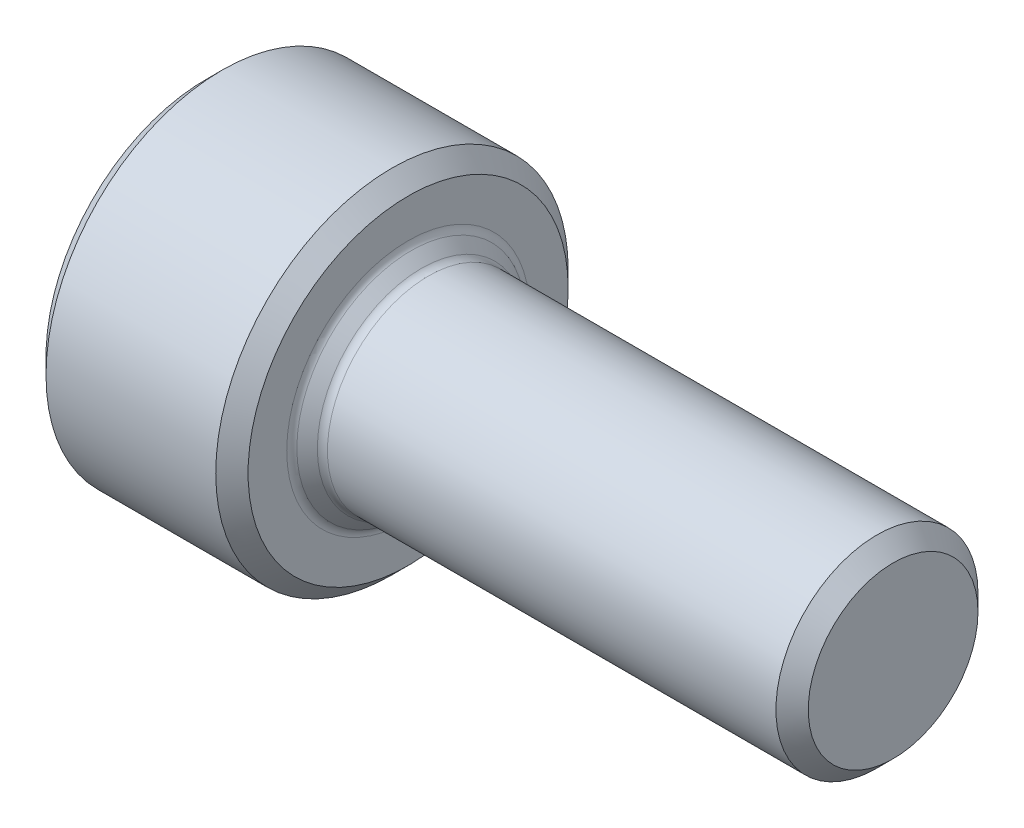
ISO-10303-21;
HEADER;
FILE_DESCRIPTION(('STEP AP214'),'2;1');
FILE_NAME('part.step','',(''),(''),'','','');
FILE_SCHEMA(('AUTOMOTIVE_DESIGN { 1 0 10303 214 1 1 1 1 }'));
ENDSEC;
DATA;
#1=APPLICATION_CONTEXT('core data for automotive mechanical design processes');
#2=APPLICATION_PROTOCOL_DEFINITION('international standard','automotive_design',2000,#1);
#3=PRODUCT_CONTEXT('',#1,'mechanical');
#4=PRODUCT('Part','Part','',(#3));
#5=PRODUCT_RELATED_PRODUCT_CATEGORY('part','',(#4));
#6=PRODUCT_DEFINITION_FORMATION('','',#4);
#7=PRODUCT_DEFINITION_CONTEXT('part definition',#1,'design');
#8=PRODUCT_DEFINITION('design','',#6,#7);
#9=PRODUCT_DEFINITION_SHAPE('','',#8);
#10=(LENGTH_UNIT() NAMED_UNIT(*) SI_UNIT(.MILLI.,.METRE.));
#11=(NAMED_UNIT(*) PLANE_ANGLE_UNIT() SI_UNIT($,.RADIAN.));
#12=(NAMED_UNIT(*) SI_UNIT($,.STERADIAN.) SOLID_ANGLE_UNIT());
#13=UNCERTAINTY_MEASURE_WITH_UNIT(LENGTH_MEASURE(1.E-05),#10,'distance_accuracy_value','');
#14=(GEOMETRIC_REPRESENTATION_CONTEXT(3) GLOBAL_UNCERTAINTY_ASSIGNED_CONTEXT((#13)) GLOBAL_UNIT_ASSIGNED_CONTEXT((#10,
#11,#12)) REPRESENTATION_CONTEXT('',''));
#15=CARTESIAN_POINT('',(0.,0.,0.));
#16=DIRECTION('',(0.,0.,1.));
#17=DIRECTION('',(1.,0.,0.));
#18=AXIS2_PLACEMENT_3D('',#15,#16,#17);
#19=CARTESIAN_POINT('',(0.,0.,0.));
#20=DIRECTION('',(1.,0.,0.));
#21=DIRECTION('',(0.,0.,-1.));
#22=AXIS2_PLACEMENT_3D('',#19,#20,#21);
#23=PLANE('',#22);
#24=CARTESIAN_POINT('',(0.,0.,0.));
#25=DIRECTION('',(1.,0.,0.));
#26=DIRECTION('',(0.,0.,-1.));
#27=AXIS2_PLACEMENT_3D('',#24,#25,#26);
#28=CIRCLE('',#27,3.00355339059327);
#29=CARTESIAN_POINT('',(0.,0.,-3.00355339059327));
#30=VERTEX_POINT('',#29);
#31=EDGE_CURVE('E11',#30,#30,#28,.F.);
#32=ORIENTED_EDGE('',*,*,#31,.T.);
#33=EDGE_LOOP('',(#32));
#34=FACE_BOUND('',#33,.T.);
#35=CARTESIAN_POINT('',(0.,0.,0.));
#36=DIRECTION('',(1.,0.,0.));
#37=DIRECTION('',(0.,0.,-1.));
#38=AXIS2_PLACEMENT_3D('',#35,#36,#37);
#39=CIRCLE('',#38,3.96);
#40=CARTESIAN_POINT('',(0.,0.,-3.96));
#41=VERTEX_POINT('',#40);
#42=EDGE_CURVE('E274',#41,#41,#39,.T.);
#43=ORIENTED_EDGE('',*,*,#42,.T.);
#44=EDGE_LOOP('',(#43));
#45=FACE_BOUND('',#44,.T.);
#46=ADVANCED_FACE('F34',(#34,#45),#23,.T.);
#47=CARTESIAN_POINT('',(-5.,0.,0.));
#48=DIRECTION('',(-1.,0.,0.));
#49=DIRECTION('',(0.,0.,1.));
#50=AXIS2_PLACEMENT_3D('',#47,#48,#49);
#51=CYLINDRICAL_SURFACE('',#50,2.);
#52=CARTESIAN_POINT('',(-5.,0.,0.));
#53=DIRECTION('',(-1.,0.,0.));
#54=DIRECTION('',(0.,0.,1.));
#55=AXIS2_PLACEMENT_3D('',#52,#53,#54);
#56=CIRCLE('',#55,2.);
#57=CARTESIAN_POINT('',(-5.,-1.21563870436552,1.58815066679724));
#58=VERTEX_POINT('',#57);
#59=CARTESIAN_POINT('',(-5.,-0.76755947030084,1.84684933320276));
#60=VERTEX_POINT('',#59);
#61=EDGE_CURVE('E265',#58,#60,#56,.T.);
#62=ORIENTED_EDGE('',*,*,#61,.T.);
#63=DIRECTION('',(-1.,0.,0.));
#64=VECTOR('',#63,1.);
#65=CARTESIAN_POINT('',(-5.,-0.76755947030084,1.84684933320276));
#66=LINE('',#65,#64);
#67=CARTESIAN_POINT('',(-2.5,-0.76755947030084,1.84684933320276));
#68=VERTEX_POINT('',#67);
#69=EDGE_CURVE('E260',#60,#68,#66,.F.);
#70=ORIENTED_EDGE('',*,*,#69,.T.);
#71=CARTESIAN_POINT('',(-2.5,0.,0.));
#72=DIRECTION('',(-1.,0.,0.));
#73=DIRECTION('',(0.,0.,1.));
#74=AXIS2_PLACEMENT_3D('',#71,#72,#73);
#75=CIRCLE('',#74,2.);
#76=CARTESIAN_POINT('',(-2.5,-1.21563870436552,1.58815066679724));
#77=VERTEX_POINT('',#76);
#78=EDGE_CURVE('E688',#77,#68,#75,.T.);
#79=ORIENTED_EDGE('',*,*,#78,.F.);
#80=DIRECTION('',(-1.,0.,0.));
#81=VECTOR('',#80,1.);
#82=CARTESIAN_POINT('',(-5.,-1.21563870436552,1.58815066679724));
#83=LINE('',#82,#81);
#84=EDGE_CURVE('E257',#77,#58,#83,.T.);
#85=ORIENTED_EDGE('',*,*,#84,.T.);
#86=EDGE_LOOP('',(#62,#70,#79,#85));
#87=FACE_BOUND('',#86,.T.);
#88=ADVANCED_FACE('F329',(#87),#51,.F.);
#89=CARTESIAN_POINT('',(-5.,-1.98319817466636,-0.258698666405527));
#90=VERTEX_POINT('',#89);
#91=CARTESIAN_POINT('',(-5.,-1.98319817466636,0.258698666405525));
#92=VERTEX_POINT('',#91);
#93=EDGE_CURVE('E647',#90,#92,#56,.T.);
#94=ORIENTED_EDGE('',*,*,#93,.T.);
#95=DIRECTION('',(-1.,0.,0.));
#96=VECTOR('',#95,1.);
#97=CARTESIAN_POINT('',(-5.,-1.98319817466636,0.258698666405525));
#98=LINE('',#97,#96);
#99=CARTESIAN_POINT('',(-2.5,-1.98319817466636,0.258698666405525));
#100=VERTEX_POINT('',#99);
#101=EDGE_CURVE('E254',#92,#100,#98,.F.);
#102=ORIENTED_EDGE('',*,*,#101,.T.);
#103=CARTESIAN_POINT('',(-2.5,-1.98319817466636,-0.258698666405527));
#104=VERTEX_POINT('',#103);
#105=EDGE_CURVE('E683',#104,#100,#75,.T.);
#106=ORIENTED_EDGE('',*,*,#105,.F.);
#107=DIRECTION('',(-1.,0.,0.));
#108=VECTOR('',#107,1.);
#109=CARTESIAN_POINT('',(-5.,-1.98319817466636,-0.258698666405527));
#110=LINE('',#109,#108);
#111=EDGE_CURVE('E251',#104,#90,#110,.T.);
#112=ORIENTED_EDGE('',*,*,#111,.T.);
#113=EDGE_LOOP('',(#94,#102,#106,#112));
#114=FACE_BOUND('',#113,.T.);
#115=ADVANCED_FACE('F335',(#114),#51,.F.);
#116=CARTESIAN_POINT('',(-5.,-0.76755947030084,-1.84684933320276));
#117=VERTEX_POINT('',#116);
#118=CARTESIAN_POINT('',(-5.,-1.21563870436552,-1.58815066679724));
#119=VERTEX_POINT('',#118);
#120=EDGE_CURVE('E649',#117,#119,#56,.T.);
#121=ORIENTED_EDGE('',*,*,#120,.T.);
#122=DIRECTION('',(-1.,0.,0.));
#123=VECTOR('',#122,1.);
#124=CARTESIAN_POINT('',(-5.,-1.21563870436552,-1.58815066679724));
#125=LINE('',#124,#123);
#126=CARTESIAN_POINT('',(-2.5,-1.21563870436552,-1.58815066679724));
#127=VERTEX_POINT('',#126);
#128=EDGE_CURVE('E248',#119,#127,#125,.F.);
#129=ORIENTED_EDGE('',*,*,#128,.T.);
#130=CARTESIAN_POINT('',(-2.5,-0.76755947030084,-1.84684933320276));
#131=VERTEX_POINT('',#130);
#132=EDGE_CURVE('E678',#131,#127,#75,.T.);
#133=ORIENTED_EDGE('',*,*,#132,.F.);
#134=DIRECTION('',(-1.,0.,0.));
#135=VECTOR('',#134,1.);
#136=CARTESIAN_POINT('',(-5.,-0.767559470300843,-1.84684933320276));
#137=LINE('',#136,#135);
#138=EDGE_CURVE('E245',#131,#117,#137,.T.);
#139=ORIENTED_EDGE('',*,*,#138,.T.);
#140=EDGE_LOOP('',(#121,#129,#133,#139));
#141=FACE_BOUND('',#140,.T.);
#142=ADVANCED_FACE('F564',(#141),#51,.F.);
#143=CARTESIAN_POINT('',(-5.,1.21563870436552,-1.58815066679724));
#144=VERTEX_POINT('',#143);
#145=CARTESIAN_POINT('',(-5.,0.767559470300844,-1.84684933320276));
#146=VERTEX_POINT('',#145);
#147=EDGE_CURVE('E652',#144,#146,#56,.T.);
#148=ORIENTED_EDGE('',*,*,#147,.T.);
#149=DIRECTION('',(-1.,0.,0.));
#150=VECTOR('',#149,1.);
#151=CARTESIAN_POINT('',(-5.,0.767559470300847,-1.84684933320276));
#152=LINE('',#151,#150);
#153=CARTESIAN_POINT('',(-2.5,0.767559470300844,-1.84684933320276));
#154=VERTEX_POINT('',#153);
#155=EDGE_CURVE('E242',#146,#154,#152,.F.);
#156=ORIENTED_EDGE('',*,*,#155,.T.);
#157=CARTESIAN_POINT('',(-2.5,1.21563870436552,-1.58815066679724));
#158=VERTEX_POINT('',#157);
#159=EDGE_CURVE('E675',#158,#154,#75,.T.);
#160=ORIENTED_EDGE('',*,*,#159,.F.);
#161=DIRECTION('',(-1.,0.,0.));
#162=VECTOR('',#161,1.);
#163=CARTESIAN_POINT('',(-5.,1.21563870436552,-1.58815066679724));
#164=LINE('',#163,#162);
#165=EDGE_CURVE('E239',#158,#144,#164,.T.);
#166=ORIENTED_EDGE('',*,*,#165,.T.);
#167=EDGE_LOOP('',(#148,#156,#160,#166));
#168=FACE_BOUND('',#167,.T.);
#169=ADVANCED_FACE('F572',(#168),#51,.F.);
#170=CARTESIAN_POINT('',(-5.,1.98319817466637,0.258698666405524));
#171=VERTEX_POINT('',#170);
#172=CARTESIAN_POINT('',(-5.,1.98319817466637,-0.258698666405522));
#173=VERTEX_POINT('',#172);
#174=EDGE_CURVE('E271',#171,#173,#56,.T.);
#175=ORIENTED_EDGE('',*,*,#174,.T.);
#176=DIRECTION('',(-1.,0.,0.));
#177=VECTOR('',#176,1.);
#178=CARTESIAN_POINT('',(-5.,1.98319817466637,-0.258698666405522));
#179=LINE('',#178,#177);
#180=CARTESIAN_POINT('',(-2.5,1.98319817466637,-0.258698666405522));
#181=VERTEX_POINT('',#180);
#182=EDGE_CURVE('E236',#173,#181,#179,.F.);
#183=ORIENTED_EDGE('',*,*,#182,.T.);
#184=CARTESIAN_POINT('',(-2.5,1.98319817466637,0.258698666405524));
#185=VERTEX_POINT('',#184);
#186=EDGE_CURVE('E674',#185,#181,#75,.T.);
#187=ORIENTED_EDGE('',*,*,#186,.F.);
#188=DIRECTION('',(-1.,0.,0.));
#189=VECTOR('',#188,1.);
#190=CARTESIAN_POINT('',(-5.,1.98319817466637,0.258698666405524));
#191=LINE('',#190,#189);
#192=EDGE_CURVE('E233',#185,#171,#191,.T.);
#193=ORIENTED_EDGE('',*,*,#192,.T.);
#194=EDGE_LOOP('',(#175,#183,#187,#193));
#195=FACE_BOUND('',#194,.T.);
#196=ADVANCED_FACE('F345',(#195),#51,.F.);
#197=CARTESIAN_POINT('',(-5.,0.,0.));
#198=DIRECTION('',(1.,0.,0.));
#199=DIRECTION('',(0.,0.,-1.));
#200=AXIS2_PLACEMENT_3D('',#197,#198,#199);
#201=CYLINDRICAL_SURFACE('',#200,4.36);
#202=CARTESIAN_POINT('',(-4.6,0.,0.));
#203=DIRECTION('',(1.,0.,0.));
#204=DIRECTION('',(0.,0.,-1.));
#205=AXIS2_PLACEMENT_3D('',#202,#203,#204);
#206=CIRCLE('',#205,4.36);
#207=CARTESIAN_POINT('',(-4.6,0.,-4.36));
#208=VERTEX_POINT('',#207);
#209=EDGE_CURVE('E280',#208,#208,#206,.T.);
#210=ORIENTED_EDGE('',*,*,#209,.T.);
#211=EDGE_LOOP('',(#210));
#212=FACE_BOUND('',#211,.T.);
#213=CARTESIAN_POINT('',(-0.4,0.,0.));
#214=DIRECTION('',(1.,0.,0.));
#215=DIRECTION('',(0.,0.,-1.));
#216=AXIS2_PLACEMENT_3D('',#213,#214,#215);
#217=CIRCLE('',#216,4.36);
#218=CARTESIAN_POINT('',(-0.4,0.,-4.36));
#219=VERTEX_POINT('',#218);
#220=EDGE_CURVE('E277',#219,#219,#217,.F.);
#221=ORIENTED_EDGE('',*,*,#220,.T.);
#222=EDGE_LOOP('',(#221));
#223=FACE_BOUND('',#222,.T.);
#224=ADVANCED_FACE('F343',(#212,#223),#201,.T.);
#225=CARTESIAN_POINT('',(-5.,0.,0.));
#226=DIRECTION('',(1.,0.,0.));
#227=DIRECTION('',(0.,0.,-1.));
#228=AXIS2_PLACEMENT_3D('',#225,#226,#227);
#229=PLANE('',#228);
#230=CARTESIAN_POINT('',(-5.,0.,0.));
#231=DIRECTION('',(1.,0.,0.));
#232=DIRECTION('',(0.,0.,-1.));
#233=AXIS2_PLACEMENT_3D('',#230,#231,#232);
#234=CIRCLE('',#233,3.95999999999999);
#235=CARTESIAN_POINT('',(-5.,0.,-3.95999999999999));
#236=VERTEX_POINT('',#235);
#237=EDGE_CURVE('E283',#236,#236,#234,.F.);
#238=ORIENTED_EDGE('',*,*,#237,.T.);
#239=EDGE_LOOP('',(#238));
#240=FACE_BOUND('',#239,.T.);
#241=ORIENTED_EDGE('',*,*,#61,.F.);
#242=DIRECTION('',(0.,0.866025403784439,0.5));
#243=VECTOR('',#242,1.);
#244=CARTESIAN_POINT('',(-5.,-1.98319817466637,1.145));
#245=LINE('',#244,#243);
#246=CARTESIAN_POINT('',(-5.,-1.98319817466637,1.145));
#247=VERTEX_POINT('',#246);
#248=EDGE_CURVE('E199',#247,#58,#245,.T.);
#249=ORIENTED_EDGE('',*,*,#248,.F.);
#250=DIRECTION('',(0.,0.,1.));
#251=VECTOR('',#250,1.);
#252=CARTESIAN_POINT('',(-5.,-1.98319817466636,-1.145));
#253=LINE('',#252,#251);
#254=EDGE_CURVE('E213',#92,#247,#253,.T.);
#255=ORIENTED_EDGE('',*,*,#254,.F.);
#256=ORIENTED_EDGE('',*,*,#93,.F.);
#257=CARTESIAN_POINT('',(-5.,-1.98319817466636,-1.145));
#258=VERTEX_POINT('',#257);
#259=EDGE_CURVE('E171',#258,#90,#253,.T.);
#260=ORIENTED_EDGE('',*,*,#259,.F.);
#261=DIRECTION('',(0.,-0.866025403784439,0.5));
#262=VECTOR('',#261,1.);
#263=CARTESIAN_POINT('',(-5.,0.,-2.29));
#264=LINE('',#263,#262);
#265=EDGE_CURVE('E210',#119,#258,#264,.T.);
#266=ORIENTED_EDGE('',*,*,#265,.F.);
#267=ORIENTED_EDGE('',*,*,#120,.F.);
#268=CARTESIAN_POINT('',(-5.,0.,-2.29));
#269=VERTEX_POINT('',#268);
#270=EDGE_CURVE('E211',#269,#117,#264,.T.);
#271=ORIENTED_EDGE('',*,*,#270,.F.);
#272=DIRECTION('',(0.,-0.866025403784439,-0.5));
#273=VECTOR('',#272,1.);
#274=CARTESIAN_POINT('',(-5.,1.98319817466637,-1.145));
#275=LINE('',#274,#273);
#276=EDGE_CURVE('E207',#146,#269,#275,.T.);
#277=ORIENTED_EDGE('',*,*,#276,.F.);
#278=ORIENTED_EDGE('',*,*,#147,.F.);
#279=CARTESIAN_POINT('',(-5.,1.98319817466637,-1.145));
#280=VERTEX_POINT('',#279);
#281=EDGE_CURVE('E208',#280,#144,#275,.T.);
#282=ORIENTED_EDGE('',*,*,#281,.F.);
#283=DIRECTION('',(0.,0.,-1.));
#284=VECTOR('',#283,1.);
#285=CARTESIAN_POINT('',(-5.,1.98319817466636,1.145));
#286=LINE('',#285,#284);
#287=EDGE_CURVE('E204',#173,#280,#286,.T.);
#288=ORIENTED_EDGE('',*,*,#287,.F.);
#289=ORIENTED_EDGE('',*,*,#174,.F.);
#290=CARTESIAN_POINT('',(-5.,1.98319817466636,1.145));
#291=VERTEX_POINT('',#290);
#292=EDGE_CURVE('E205',#291,#171,#286,.T.);
#293=ORIENTED_EDGE('',*,*,#292,.F.);
#294=DIRECTION('',(0.,0.866025403784439,-0.5));
#295=VECTOR('',#294,1.);
#296=CARTESIAN_POINT('',(-5.,0.,2.29));
#297=LINE('',#296,#295);
#298=CARTESIAN_POINT('',(-5.,1.21563870436553,1.58815066679724));
#299=VERTEX_POINT('',#298);
#300=EDGE_CURVE('E201',#299,#291,#297,.T.);
#301=ORIENTED_EDGE('',*,*,#300,.F.);
#302=CARTESIAN_POINT('',(-5.,0.767559470300838,1.84684933320276));
#303=VERTEX_POINT('',#302);
#304=EDGE_CURVE('E267',#303,#299,#56,.T.);
#305=ORIENTED_EDGE('',*,*,#304,.F.);
#306=CARTESIAN_POINT('',(-5.,0.,2.29));
#307=VERTEX_POINT('',#306);
#308=EDGE_CURVE('E202',#307,#303,#297,.T.);
#309=ORIENTED_EDGE('',*,*,#308,.F.);
#310=EDGE_CURVE('E177',#60,#307,#245,.T.);
#311=ORIENTED_EDGE('',*,*,#310,.F.);
#312=EDGE_LOOP('',(#241,#249,#255,#256,#260,#266,#267,#271,#277,#278,#282,#288,#289,#293,#301,
#305,#309,#311));
#313=FACE_BOUND('',#312,.T.);
#314=ADVANCED_FACE('F342',(#240,#313),#229,.F.);
#315=ORIENTED_EDGE('',*,*,#304,.T.);
#316=DIRECTION('',(-1.,0.,0.));
#317=VECTOR('',#316,1.);
#318=CARTESIAN_POINT('',(-5.,1.21563870436553,1.58815066679723));
#319=LINE('',#318,#317);
#320=CARTESIAN_POINT('',(-2.5,1.21563870436553,1.58815066679724));
#321=VERTEX_POINT('',#320);
#322=EDGE_CURVE('E230',#299,#321,#319,.F.);
#323=ORIENTED_EDGE('',*,*,#322,.T.);
#324=CARTESIAN_POINT('',(-2.5,0.767559470300838,1.84684933320277));
#325=VERTEX_POINT('',#324);
#326=EDGE_CURVE('E262',#325,#321,#75,.T.);
#327=ORIENTED_EDGE('',*,*,#326,.F.);
#328=DIRECTION('',(-1.,0.,0.));
#329=VECTOR('',#328,1.);
#330=CARTESIAN_POINT('',(-5.,0.767559470300835,1.84684933320277));
#331=LINE('',#330,#329);
#332=EDGE_CURVE('E184',#325,#303,#331,.T.);
#333=ORIENTED_EDGE('',*,*,#332,.T.);
#334=EDGE_LOOP('',(#315,#323,#327,#333));
#335=FACE_BOUND('',#334,.T.);
#336=ADVANCED_FACE('F338',(#335),#51,.F.);
#337=CARTESIAN_POINT('',(-2.5,0.,0.));
#338=DIRECTION('',(-1.,0.,0.));
#339=DIRECTION('',(0.,0.,1.));
#340=AXIS2_PLACEMENT_3D('',#337,#338,#339);
#341=CONICAL_SURFACE('',#340,2.,1.0471975511966);
#342=CARTESIAN_POINT('',(-1.34529946162075,0.,0.));
#343=VERTEX_POINT('',#342);
#344=VERTEX_LOOP('',#343);
#345=FACE_BOUND('',#344,.T.);
#346=ORIENTED_EDGE('',*,*,#326,.T.);
#347=EDGE_CURVE('E266',#321,#185,#75,.T.);
#348=ORIENTED_EDGE('',*,*,#347,.T.);
#349=ORIENTED_EDGE('',*,*,#186,.T.);
#350=EDGE_CURVE('E671',#181,#158,#75,.T.);
#351=ORIENTED_EDGE('',*,*,#350,.T.);
#352=ORIENTED_EDGE('',*,*,#159,.T.);
#353=EDGE_CURVE('E676',#154,#131,#75,.T.);
#354=ORIENTED_EDGE('',*,*,#353,.T.);
#355=ORIENTED_EDGE('',*,*,#132,.T.);
#356=EDGE_CURVE('E680',#127,#104,#75,.T.);
#357=ORIENTED_EDGE('',*,*,#356,.T.);
#358=ORIENTED_EDGE('',*,*,#105,.T.);
#359=EDGE_CURVE('E685',#100,#77,#75,.T.);
#360=ORIENTED_EDGE('',*,*,#359,.T.);
#361=ORIENTED_EDGE('',*,*,#78,.T.);
#362=EDGE_CURVE('E168',#68,#325,#75,.T.);
#363=ORIENTED_EDGE('',*,*,#362,.T.);
#364=EDGE_LOOP('',(#346,#348,#349,#351,#352,#354,#355,#357,#358,#360,#361,#363));
#365=FACE_BOUND('',#364,.T.);
#366=ADVANCED_FACE('F551',(#345,#365),#341,.F.);
#367=CARTESIAN_POINT('',(-2.5,1.98319817466636,3.435));
#368=DIRECTION('',(-1.,0.,0.));
#369=DIRECTION('',(0.,0.,1.));
#370=AXIS2_PLACEMENT_3D('',#367,#368,#369);
#371=PLANE('',#370);
#372=ORIENTED_EDGE('',*,*,#362,.F.);
#373=DIRECTION('',(0.,0.866025403784439,0.5));
#374=VECTOR('',#373,1.);
#375=CARTESIAN_POINT('',(-2.5,-1.98319817466637,1.145));
#376=LINE('',#375,#374);
#377=CARTESIAN_POINT('',(-2.5,0.,2.29));
#378=VERTEX_POINT('',#377);
#379=EDGE_CURVE('E161',#68,#378,#376,.T.);
#380=ORIENTED_EDGE('',*,*,#379,.T.);
#381=DIRECTION('',(0.,0.866025403784439,-0.5));
#382=VECTOR('',#381,1.);
#383=CARTESIAN_POINT('',(-2.5,0.,2.29));
#384=LINE('',#383,#382);
#385=EDGE_CURVE('E165',#378,#325,#384,.T.);
#386=ORIENTED_EDGE('',*,*,#385,.T.);
#387=EDGE_LOOP('',(#372,#380,#386));
#388=FACE_BOUND('',#387,.T.);
#389=ADVANCED_FACE('F163',(#388),#371,.T.);
#390=CARTESIAN_POINT('',(-2.5,0.,2.29));
#391=DIRECTION('',(0.,0.5,0.866025403784439));
#392=DIRECTION('',(0.,-0.866025403784439,0.5));
#393=AXIS2_PLACEMENT_3D('',#390,#391,#392);
#394=PLANE('',#393);
#395=ORIENTED_EDGE('',*,*,#385,.F.);
#396=DIRECTION('',(-1.,0.,0.));
#397=VECTOR('',#396,1.);
#398=CARTESIAN_POINT('',(-2.5,0.,2.29));
#399=LINE('',#398,#397);
#400=EDGE_CURVE('E174',#378,#307,#399,.T.);
#401=ORIENTED_EDGE('',*,*,#400,.T.);
#402=ORIENTED_EDGE('',*,*,#308,.T.);
#403=ORIENTED_EDGE('',*,*,#332,.F.);
#404=EDGE_LOOP('',(#395,#401,#402,#403));
#405=FACE_BOUND('',#404,.T.);
#406=ADVANCED_FACE('F182',(#405),#394,.F.);
#407=CARTESIAN_POINT('',(-2.5,-1.98319817466637,1.145));
#408=DIRECTION('',(0.,-0.5,0.866025403784439));
#409=DIRECTION('',(0.,-0.866025403784439,-0.5));
#410=AXIS2_PLACEMENT_3D('',#407,#408,#409);
#411=PLANE('',#410);
#412=ORIENTED_EDGE('',*,*,#310,.T.);
#413=ORIENTED_EDGE('',*,*,#400,.F.);
#414=ORIENTED_EDGE('',*,*,#379,.F.);
#415=ORIENTED_EDGE('',*,*,#69,.F.);
#416=EDGE_LOOP('',(#412,#413,#414,#415));
#417=FACE_BOUND('',#416,.T.);
#418=ADVANCED_FACE('F175',(#417),#411,.F.);
#419=ORIENTED_EDGE('',*,*,#347,.F.);
#420=CARTESIAN_POINT('',(-2.5,1.98319817466636,1.145));
#421=VERTEX_POINT('',#420);
#422=EDGE_CURVE('E186',#321,#421,#384,.T.);
#423=ORIENTED_EDGE('',*,*,#422,.T.);
#424=DIRECTION('',(0.,0.,-1.));
#425=VECTOR('',#424,1.);
#426=CARTESIAN_POINT('',(-2.5,1.98319817466636,1.145));
#427=LINE('',#426,#425);
#428=EDGE_CURVE('E188',#421,#185,#427,.T.);
#429=ORIENTED_EDGE('',*,*,#428,.T.);
#430=EDGE_LOOP('',(#419,#423,#429));
#431=FACE_BOUND('',#430,.T.);
#432=ADVANCED_FACE('F509',(#431),#371,.T.);
#433=ORIENTED_EDGE('',*,*,#300,.T.);
#434=DIRECTION('',(-1.,0.,0.));
#435=VECTOR('',#434,1.);
#436=CARTESIAN_POINT('',(-2.5,1.98319817466636,1.145));
#437=LINE('',#436,#435);
#438=EDGE_CURVE('E180',#421,#291,#437,.T.);
#439=ORIENTED_EDGE('',*,*,#438,.F.);
#440=ORIENTED_EDGE('',*,*,#422,.F.);
#441=ORIENTED_EDGE('',*,*,#322,.F.);
#442=EDGE_LOOP('',(#433,#439,#440,#441));
#443=FACE_BOUND('',#442,.T.);
#444=ADVANCED_FACE('F516',(#443),#394,.F.);
#445=CARTESIAN_POINT('',(-2.5,1.98319817466636,1.145));
#446=DIRECTION('',(0.,1.,0.));
#447=DIRECTION('',(0.,0.,1.));
#448=AXIS2_PLACEMENT_3D('',#445,#446,#447);
#449=PLANE('',#448);
#450=ORIENTED_EDGE('',*,*,#428,.F.);
#451=ORIENTED_EDGE('',*,*,#438,.T.);
#452=ORIENTED_EDGE('',*,*,#292,.T.);
#453=ORIENTED_EDGE('',*,*,#192,.F.);
#454=EDGE_LOOP('',(#450,#451,#452,#453));
#455=FACE_BOUND('',#454,.T.);
#456=ADVANCED_FACE('F501',(#455),#449,.F.);
#457=ORIENTED_EDGE('',*,*,#350,.F.);
#458=CARTESIAN_POINT('',(-2.5,1.98319817466637,-1.145));
#459=VERTEX_POINT('',#458);
#460=EDGE_CURVE('E185',#181,#459,#427,.T.);
#461=ORIENTED_EDGE('',*,*,#460,.T.);
#462=DIRECTION('',(0.,-0.866025403784439,-0.5));
#463=VECTOR('',#462,1.);
#464=CARTESIAN_POINT('',(-2.5,1.98319817466637,-1.145));
#465=LINE('',#464,#463);
#466=EDGE_CURVE('E192',#459,#158,#465,.T.);
#467=ORIENTED_EDGE('',*,*,#466,.T.);
#468=EDGE_LOOP('',(#457,#461,#467));
#469=FACE_BOUND('',#468,.T.);
#470=ADVANCED_FACE('F484',(#469),#371,.T.);
#471=ORIENTED_EDGE('',*,*,#287,.T.);
#472=DIRECTION('',(-1.,0.,0.));
#473=VECTOR('',#472,1.);
#474=CARTESIAN_POINT('',(-2.5,1.98319817466637,-1.145));
#475=LINE('',#474,#473);
#476=EDGE_CURVE('E224',#459,#280,#475,.T.);
#477=ORIENTED_EDGE('',*,*,#476,.F.);
#478=ORIENTED_EDGE('',*,*,#460,.F.);
#479=ORIENTED_EDGE('',*,*,#182,.F.);
#480=EDGE_LOOP('',(#471,#477,#478,#479));
#481=FACE_BOUND('',#480,.T.);
#482=ADVANCED_FACE('F491',(#481),#449,.F.);
#483=CARTESIAN_POINT('',(-2.5,1.98319817466637,-1.145));
#484=DIRECTION('',(0.,0.5,-0.866025403784439));
#485=DIRECTION('',(0.,0.866025403784439,0.5));
#486=AXIS2_PLACEMENT_3D('',#483,#484,#485);
#487=PLANE('',#486);
#488=ORIENTED_EDGE('',*,*,#466,.F.);
#489=ORIENTED_EDGE('',*,*,#476,.T.);
#490=ORIENTED_EDGE('',*,*,#281,.T.);
#491=ORIENTED_EDGE('',*,*,#165,.F.);
#492=EDGE_LOOP('',(#488,#489,#490,#491));
#493=FACE_BOUND('',#492,.T.);
#494=ADVANCED_FACE('F476',(#493),#487,.F.);
#495=ORIENTED_EDGE('',*,*,#353,.F.);
#496=CARTESIAN_POINT('',(-2.5,0.,-2.29));
#497=VERTEX_POINT('',#496);
#498=EDGE_CURVE('E191',#154,#497,#465,.T.);
#499=ORIENTED_EDGE('',*,*,#498,.T.);
#500=DIRECTION('',(0.,-0.866025403784439,0.5));
#501=VECTOR('',#500,1.);
#502=CARTESIAN_POINT('',(-2.5,0.,-2.29));
#503=LINE('',#502,#501);
#504=EDGE_CURVE('E195',#497,#131,#503,.T.);
#505=ORIENTED_EDGE('',*,*,#504,.T.);
#506=EDGE_LOOP('',(#495,#499,#505));
#507=FACE_BOUND('',#506,.T.);
#508=ADVANCED_FACE('F459',(#507),#371,.T.);
#509=ORIENTED_EDGE('',*,*,#276,.T.);
#510=DIRECTION('',(-1.,0.,0.));
#511=VECTOR('',#510,1.);
#512=CARTESIAN_POINT('',(-2.5,0.,-2.29));
#513=LINE('',#512,#511);
#514=EDGE_CURVE('E221',#497,#269,#513,.T.);
#515=ORIENTED_EDGE('',*,*,#514,.F.);
#516=ORIENTED_EDGE('',*,*,#498,.F.);
#517=ORIENTED_EDGE('',*,*,#155,.F.);
#518=EDGE_LOOP('',(#509,#515,#516,#517));
#519=FACE_BOUND('',#518,.T.);
#520=ADVANCED_FACE('F466',(#519),#487,.F.);
#521=CARTESIAN_POINT('',(-2.5,0.,-2.29));
#522=DIRECTION('',(0.,-0.5,-0.866025403784439));
#523=DIRECTION('',(0.,0.866025403784439,-0.5));
#524=AXIS2_PLACEMENT_3D('',#521,#522,#523);
#525=PLANE('',#524);
#526=ORIENTED_EDGE('',*,*,#504,.F.);
#527=ORIENTED_EDGE('',*,*,#514,.T.);
#528=ORIENTED_EDGE('',*,*,#270,.T.);
#529=ORIENTED_EDGE('',*,*,#138,.F.);
#530=EDGE_LOOP('',(#526,#527,#528,#529));
#531=FACE_BOUND('',#530,.T.);
#532=ADVANCED_FACE('F452',(#531),#525,.F.);
#533=ORIENTED_EDGE('',*,*,#356,.F.);
#534=CARTESIAN_POINT('',(-2.5,-1.98319817466636,-1.145));
#535=VERTEX_POINT('',#534);
#536=EDGE_CURVE('E194',#127,#535,#503,.T.);
#537=ORIENTED_EDGE('',*,*,#536,.T.);
#538=DIRECTION('',(0.,0.,1.));
#539=VECTOR('',#538,1.);
#540=CARTESIAN_POINT('',(-2.5,-1.98319817466636,-1.145));
#541=LINE('',#540,#539);
#542=EDGE_CURVE('E57',#535,#104,#541,.T.);
#543=ORIENTED_EDGE('',*,*,#542,.T.);
#544=EDGE_LOOP('',(#533,#537,#543));
#545=FACE_BOUND('',#544,.T.);
#546=ADVANCED_FACE('F416',(#545),#371,.T.);
#547=ORIENTED_EDGE('',*,*,#265,.T.);
#548=DIRECTION('',(-1.,0.,0.));
#549=VECTOR('',#548,1.);
#550=CARTESIAN_POINT('',(-2.5,-1.98319817466636,-1.145));
#551=LINE('',#550,#549);
#552=EDGE_CURVE('E218',#535,#258,#551,.T.);
#553=ORIENTED_EDGE('',*,*,#552,.F.);
#554=ORIENTED_EDGE('',*,*,#536,.F.);
#555=ORIENTED_EDGE('',*,*,#128,.F.);
#556=EDGE_LOOP('',(#547,#553,#554,#555));
#557=FACE_BOUND('',#556,.T.);
#558=ADVANCED_FACE('F442',(#557),#525,.F.);
#559=CARTESIAN_POINT('',(-2.5,-1.98319817466636,-1.145));
#560=DIRECTION('',(0.,-1.,0.));
#561=DIRECTION('',(0.,0.,-1.));
#562=AXIS2_PLACEMENT_3D('',#559,#560,#561);
#563=PLANE('',#562);
#564=ORIENTED_EDGE('',*,*,#542,.F.);
#565=ORIENTED_EDGE('',*,*,#552,.T.);
#566=ORIENTED_EDGE('',*,*,#259,.T.);
#567=ORIENTED_EDGE('',*,*,#111,.F.);
#568=EDGE_LOOP('',(#564,#565,#566,#567));
#569=FACE_BOUND('',#568,.T.);
#570=ADVANCED_FACE('F427',(#569),#563,.F.);
#571=CARTESIAN_POINT('',(-2.5,-1.98319817466637,1.145));
#572=VERTEX_POINT('',#571);
#573=EDGE_CURVE('E49',#572,#77,#376,.T.);
#574=ORIENTED_EDGE('',*,*,#573,.F.);
#575=DIRECTION('',(-1.,0.,0.));
#576=VECTOR('',#575,1.);
#577=CARTESIAN_POINT('',(-2.5,-1.98319817466637,1.145));
#578=LINE('',#577,#576);
#579=EDGE_CURVE('E215',#572,#247,#578,.T.);
#580=ORIENTED_EDGE('',*,*,#579,.T.);
#581=ORIENTED_EDGE('',*,*,#248,.T.);
#582=ORIENTED_EDGE('',*,*,#84,.F.);
#583=EDGE_LOOP('',(#574,#580,#581,#582));
#584=FACE_BOUND('',#583,.T.);
#585=ADVANCED_FACE('F424',(#584),#411,.F.);
#586=ORIENTED_EDGE('',*,*,#254,.T.);
#587=ORIENTED_EDGE('',*,*,#579,.F.);
#588=EDGE_CURVE('E197',#100,#572,#541,.T.);
#589=ORIENTED_EDGE('',*,*,#588,.F.);
#590=ORIENTED_EDGE('',*,*,#101,.F.);
#591=EDGE_LOOP('',(#586,#587,#589,#590));
#592=FACE_BOUND('',#591,.T.);
#593=ADVANCED_FACE('F414',(#592),#563,.F.);
#594=ORIENTED_EDGE('',*,*,#359,.F.);
#595=ORIENTED_EDGE('',*,*,#588,.T.);
#596=ORIENTED_EDGE('',*,*,#573,.T.);
#597=EDGE_LOOP('',(#594,#595,#596));
#598=FACE_BOUND('',#597,.T.);
#599=ADVANCED_FACE('F310',(#598),#371,.T.);
#600=CARTESIAN_POINT('',(12.,0.,0.));
#601=DIRECTION('',(-1.,0.,0.));
#602=DIRECTION('',(0.,0.,1.));
#603=AXIS2_PLACEMENT_3D('',#600,#601,#602);
#604=CYLINDRICAL_SURFACE('',#603,2.5);
#605=CARTESIAN_POINT('',(0.503553390593273,0.,0.));
#606=DIRECTION('',(1.,0.,0.));
#607=DIRECTION('',(0.,0.,-1.));
#608=AXIS2_PLACEMENT_3D('',#605,#606,#607);
#609=CIRCLE('',#608,2.5);
#610=CARTESIAN_POINT('',(0.503553390593273,0.,-2.5));
#611=VERTEX_POINT('',#610);
#612=EDGE_CURVE('E289',#611,#611,#609,.T.);
#613=ORIENTED_EDGE('',*,*,#612,.T.);
#614=EDGE_LOOP('',(#613));
#615=FACE_BOUND('',#614,.T.);
#616=CARTESIAN_POINT('',(11.6,0.,0.));
#617=DIRECTION('',(1.,0.,0.));
#618=DIRECTION('',(0.,0.,-1.));
#619=AXIS2_PLACEMENT_3D('',#616,#617,#618);
#620=CIRCLE('',#619,2.5);
#621=CARTESIAN_POINT('',(11.6,0.,-2.5));
#622=VERTEX_POINT('',#621);
#623=EDGE_CURVE('E270',#622,#622,#620,.F.);
#624=ORIENTED_EDGE('',*,*,#623,.T.);
#625=EDGE_LOOP('',(#624));
#626=FACE_BOUND('',#625,.T.);
#627=ADVANCED_FACE('F306',(#615,#626),#604,.T.);
#628=CARTESIAN_POINT('',(12.,0.,0.));
#629=DIRECTION('',(1.,0.,0.));
#630=DIRECTION('',(0.,0.,-1.));
#631=AXIS2_PLACEMENT_3D('',#628,#629,#630);
#632=PLANE('',#631);
#633=CARTESIAN_POINT('',(12.,0.,0.));
#634=DIRECTION('',(1.,0.,0.));
#635=DIRECTION('',(0.,0.,-1.));
#636=AXIS2_PLACEMENT_3D('',#633,#634,#635);
#637=CIRCLE('',#636,2.1);
#638=CARTESIAN_POINT('',(12.,0.,-2.1));
#639=VERTEX_POINT('',#638);
#640=EDGE_CURVE('E286',#639,#639,#637,.T.);
#641=ORIENTED_EDGE('',*,*,#640,.T.);
#642=EDGE_LOOP('',(#641));
#643=FACE_BOUND('',#642,.T.);
#644=ADVANCED_FACE('F309',(#643),#632,.T.);
#645=CARTESIAN_POINT('',(0.399999999999999,0.,0.));
#646=DIRECTION('',(-1.,0.,0.));
#647=DIRECTION('',(0.,0.,1.));
#648=AXIS2_PLACEMENT_3D('',#645,#646,#647);
#649=CONICAL_SURFACE('',#648,2.5,0.785398163397442);
#650=CARTESIAN_POINT('',(0.326776695296637,0.,0.));
#651=DIRECTION('',(-1.,0.,0.));
#652=DIRECTION('',(0.,0.,1.));
#653=AXIS2_PLACEMENT_3D('',#650,#651,#652);
#654=CIRCLE('',#653,2.57322330470336);
#655=CARTESIAN_POINT('',(0.326776695296637,0.,2.57322330470336));
#656=VERTEX_POINT('',#655);
#657=EDGE_CURVE('E42',#656,#656,#654,.T.);
#658=CARTESIAN_POINT('',(0.0732233047033648,0.,0.));
#659=DIRECTION('',(1.,0.,0.));
#660=DIRECTION('',(0.,0.,-1.));
#661=AXIS2_PLACEMENT_3D('',#658,#659,#660);
#662=CIRCLE('',#661,2.82677669529663);
#663=CARTESIAN_POINT('',(0.0732233047033648,0.,2.82677669529663));
#664=VERTEX_POINT('',#663);
#665=EDGE_CURVE('E292',#664,#664,#662,.T.);
#666=CARTESIAN_POINT('',(0.326776695296637,0.,2.57322330470336));
#667=CARTESIAN_POINT('',(0.324135514144624,0.,2.57586448585537));
#668=CARTESIAN_POINT('',(0.321494332992611,0.,2.57850566700739));
#669=CARTESIAN_POINT('',(0.316211970688584,0.,2.58378802931141));
#670=CARTESIAN_POINT('',(0.313570789536571,0.,2.58642921046343));
#671=CARTESIAN_POINT('',(0.308288427232544,0.,2.59171157276745));
#672=CARTESIAN_POINT('',(0.305647246080531,0.,2.59435275391947));
#673=CARTESIAN_POINT('',(0.300364883776505,0.,2.59963511622349));
#674=CARTESIAN_POINT('',(0.297723702624491,0.,2.60227629737551));
#675=CARTESIAN_POINT('',(0.292441340320465,0.,2.60755865967953));
#676=CARTESIAN_POINT('',(0.289800159168452,0.,2.61019984083155));
#677=CARTESIAN_POINT('',(0.284517796864425,0.,2.61548220313557));
#678=CARTESIAN_POINT('',(0.281876615712412,0.,2.61812338428759));
#679=CARTESIAN_POINT('',(0.276594253408385,0.,2.62340574659161));
#680=CARTESIAN_POINT('',(0.273953072256372,0.,2.62604692774363));
#681=CARTESIAN_POINT('',(0.268670709952346,0.,2.63132929004765));
#682=CARTESIAN_POINT('',(0.266029528800332,0.,2.63397047119967));
#683=CARTESIAN_POINT('',(0.260747166496306,0.,2.63925283350369));
#684=CARTESIAN_POINT('',(0.258105985344293,0.,2.64189401465571));
#685=CARTESIAN_POINT('',(0.252823623040266,0.,2.64717637695973));
#686=CARTESIAN_POINT('',(0.250182441888253,0.,2.64981755811174));
#687=CARTESIAN_POINT('',(0.244900079584226,0.,2.65509992041577));
#688=CARTESIAN_POINT('',(0.242258898432213,0.,2.65774110156778));
#689=CARTESIAN_POINT('',(0.236976536128186,0.,2.66302346387181));
#690=CARTESIAN_POINT('',(0.234335354976173,0.,2.66566464502382));
#691=CARTESIAN_POINT('',(0.229052992672147,0.,2.67094700732785));
#692=CARTESIAN_POINT('',(0.226411811520133,0.,2.67358818847986));
#693=CARTESIAN_POINT('',(0.221129449216107,0.,2.67887055078389));
#694=CARTESIAN_POINT('',(0.218488268064094,0.,2.6815117319359));
#695=CARTESIAN_POINT('',(0.213205905760067,0.,2.68679409423993));
#696=CARTESIAN_POINT('',(0.210564724608054,0.,2.68943527539194));
#697=CARTESIAN_POINT('',(0.205282362304027,0.,2.69471763769597));
#698=CARTESIAN_POINT('',(0.202641181152014,0.,2.69735881884798));
#699=CARTESIAN_POINT('',(0.197358818847988,0.,2.70264118115201));
#700=CARTESIAN_POINT('',(0.194717637695974,0.,2.70528236230402));
#701=CARTESIAN_POINT('',(0.189435275391948,0.,2.71056472460805));
#702=CARTESIAN_POINT('',(0.186794094239935,0.,2.71320590576006));
#703=CARTESIAN_POINT('',(0.181511731935908,0.,2.71848826806409));
#704=CARTESIAN_POINT('',(0.178870550783895,0.,2.7211294492161));
#705=CARTESIAN_POINT('',(0.173588188479868,0.,2.72641181152013));
#706=CARTESIAN_POINT('',(0.170947007327855,0.,2.72905299267214));
#707=CARTESIAN_POINT('',(0.165664645023829,0.,2.73433535497617));
#708=CARTESIAN_POINT('',(0.163023463871815,0.,2.73697653612818));
#709=CARTESIAN_POINT('',(0.157741101567789,0.,2.74225889843221));
#710=CARTESIAN_POINT('',(0.155099920415776,0.,2.74490007958422));
#711=CARTESIAN_POINT('',(0.149817558111749,0.,2.75018244188825));
#712=CARTESIAN_POINT('',(0.147176376959736,0.,2.75282362304026));
#713=CARTESIAN_POINT('',(0.141894014655709,0.,2.75810598534429));
#714=CARTESIAN_POINT('',(0.139252833503696,0.,2.7607471664963));
#715=CARTESIAN_POINT('',(0.13397047119967,0.,2.76602952880033));
#716=CARTESIAN_POINT('',(0.131329290047656,0.,2.76867070995234));
#717=CARTESIAN_POINT('',(0.12604692774363,0.,2.77395307225637));
#718=CARTESIAN_POINT('',(0.123405746591617,0.,2.77659425340838));
#719=CARTESIAN_POINT('',(0.11812338428759,0.,2.78187661571241));
#720=CARTESIAN_POINT('',(0.115482203135577,0.,2.78451779686442));
#721=CARTESIAN_POINT('',(0.11019984083155,0.,2.78980015916845));
#722=CARTESIAN_POINT('',(0.107558659679537,0.,2.79244134032046));
#723=CARTESIAN_POINT('',(0.102276297375511,0.,2.79772370262449));
#724=CARTESIAN_POINT('',(0.0996351162234973,0.,2.8003648837765));
#725=CARTESIAN_POINT('',(0.0943527539194708,0.,2.80564724608052));
#726=CARTESIAN_POINT('',(0.0917115727674576,0.,2.80828842723254));
#727=CARTESIAN_POINT('',(0.0864292104634311,0.,2.81357078953656));
#728=CARTESIAN_POINT('',(0.0837880293114178,0.,2.81621197068858));
#729=CARTESIAN_POINT('',(0.0785056670073913,0.,2.8214943329926));
#730=CARTESIAN_POINT('',(0.075864485855378,0.,2.82413551414462));
#731=CARTESIAN_POINT('',(0.0732233047033648,0.,2.82677669529663));
#732=B_SPLINE_CURVE_WITH_KNOTS('',3,(#666,#667,#668,#669,#670,#671,#672,#673,#674,#675,#676,
#677,#678,#679,#680,#681,#682,#683,#684,#685,#686,#687,#688,#689,#690,#691,#692,#693,#694,#695,
#696,#697,#698,#699,#700,#701,#702,#703,#704,#705,#706,#707,#708,#709,#710,#711,#712,#713,#714,
#715,#716,#717,#718,#719,#720,#721,#722,#723,#724,#725,#726,#727,#728,#729,#730,#731),
.UNSPECIFIED.,.F.,.F.,(4,2,2,2,2,2,2,2,2,2,2,2,2,2,2,2,2,2,2,2,2,2,2,2,2,2,2,2,2,2,2,2,4),(0.,
0.011205582617584,0.0224111652351679,0.0336167478527519,0.0448223304703358,0.0560279130879198,
0.0672334957055038,0.0784390783230877,0.0896446609406717,0.100850243558256,0.11205582617584,
0.123261408793424,0.134466991411007,0.145672574028591,0.156878156646175,0.168083739263759,
0.179289321881343,0.190494904498927,0.201700487116511,0.212906069734095,0.224111652351679,
0.235317234969263,0.246522817586847,0.257728400204431,0.268933982822015,0.280139565439599,
0.291345148057182,0.302550730674766,0.31375631329235,0.324961895909934,0.336167478527518,
0.347373061145102,0.358578643762686),.UNSPECIFIED.);
#733=EDGE_CURVE('BSEAM297',#656,#664,#732,.T.);
#734=ORIENTED_EDGE('',*,*,#657,.T.);
#735=ORIENTED_EDGE('',*,*,#665,.T.);
#736=ORIENTED_EDGE('',*,*,#733,.T.);
#737=ORIENTED_EDGE('',*,*,#733,.F.);
#738=EDGE_LOOP('',(#734,#736,#735,#737));
#739=FACE_BOUND('',#738,.T.);
#740=ADVANCED_FACE('F297',(#739),#649,.T.);
#741=CARTESIAN_POINT('',(-4.6,0.,0.));
#742=DIRECTION('',(1.,0.,0.));
#743=DIRECTION('',(0.,0.,-1.));
#744=AXIS2_PLACEMENT_3D('',#741,#742,#743);
#745=CONICAL_SURFACE('',#744,4.36,0.785398163397453);
#746=ORIENTED_EDGE('',*,*,#237,.F.);
#747=EDGE_LOOP('',(#746));
#748=FACE_BOUND('',#747,.T.);
#749=ORIENTED_EDGE('',*,*,#209,.F.);
#750=EDGE_LOOP('',(#749));
#751=FACE_BOUND('',#750,.T.);
#752=ADVANCED_FACE('F326',(#748,#751),#745,.T.);
#753=CARTESIAN_POINT('',(0.,0.,0.));
#754=DIRECTION('',(-1.,0.,0.));
#755=DIRECTION('',(0.,0.,1.));
#756=AXIS2_PLACEMENT_3D('',#753,#754,#755);
#757=CONICAL_SURFACE('',#756,3.96,0.785398163397446);
#758=ORIENTED_EDGE('',*,*,#220,.F.);
#759=EDGE_LOOP('',(#758));
#760=FACE_BOUND('',#759,.T.);
#761=ORIENTED_EDGE('',*,*,#42,.F.);
#762=EDGE_LOOP('',(#761));
#763=FACE_BOUND('',#762,.T.);
#764=ADVANCED_FACE('F316',(#760,#763),#757,.T.);
#765=CARTESIAN_POINT('',(12.,0.,0.));
#766=DIRECTION('',(-1.,0.,0.));
#767=DIRECTION('',(0.,0.,1.));
#768=AXIS2_PLACEMENT_3D('',#765,#766,#767);
#769=CONICAL_SURFACE('',#768,2.1,0.785398163397448);
#770=ORIENTED_EDGE('',*,*,#623,.F.);
#771=EDGE_LOOP('',(#770));
#772=FACE_BOUND('',#771,.T.);
#773=ORIENTED_EDGE('',*,*,#640,.F.);
#774=EDGE_LOOP('',(#773));
#775=FACE_BOUND('',#774,.T.);
#776=ADVANCED_FACE('F303',(#772,#775),#769,.T.);
#777=CARTESIAN_POINT('',(0.503553390593273,0.,0.));
#778=DIRECTION('',(1.,0.,0.));
#779=DIRECTION('',(0.,0.,-1.));
#780=AXIS2_PLACEMENT_3D('',#777,#778,#779);
#781=TOROIDAL_SURFACE('',#780,2.75,0.25);
#782=ORIENTED_EDGE('',*,*,#657,.F.);
#783=EDGE_LOOP('',(#782));
#784=FACE_BOUND('',#783,.T.);
#785=ORIENTED_EDGE('',*,*,#612,.F.);
#786=EDGE_LOOP('',(#785));
#787=FACE_BOUND('',#786,.T.);
#788=ADVANCED_FACE('F300',(#784,#787),#781,.F.);
#789=CARTESIAN_POINT('',(0.25,0.,0.));
#790=DIRECTION('',(1.,0.,0.));
#791=DIRECTION('',(0.,0.,-1.));
#792=AXIS2_PLACEMENT_3D('',#789,#790,#791);
#793=TOROIDAL_SURFACE('',#792,3.00355339059327,0.25);
#794=ORIENTED_EDGE('',*,*,#665,.F.);
#795=EDGE_LOOP('',(#794));
#796=FACE_BOUND('',#795,.T.);
#797=ORIENTED_EDGE('',*,*,#31,.F.);
#798=EDGE_LOOP('',(#797));
#799=FACE_BOUND('',#798,.T.);
#800=ADVANCED_FACE('F36',(#796,#799),#793,.F.);
#801=CLOSED_SHELL('',(#46,#88,#115,#142,#169,#196,#224,#314,#336,#366,#389,#406,#418,#432,#444,
#456,#470,#482,#494,#508,#520,#532,#546,#558,#570,#585,#593,#599,#627,#644,#740,#752,#764,#776,
#788,#800));
#802=MANIFOLD_SOLID_BREP('B2',#801);
#803=ADVANCED_BREP_SHAPE_REPRESENTATION('',(#18,#802),#14);
#804=SHAPE_DEFINITION_REPRESENTATION(#9,#803);
ENDSEC;
END-ISO-10303-21;
